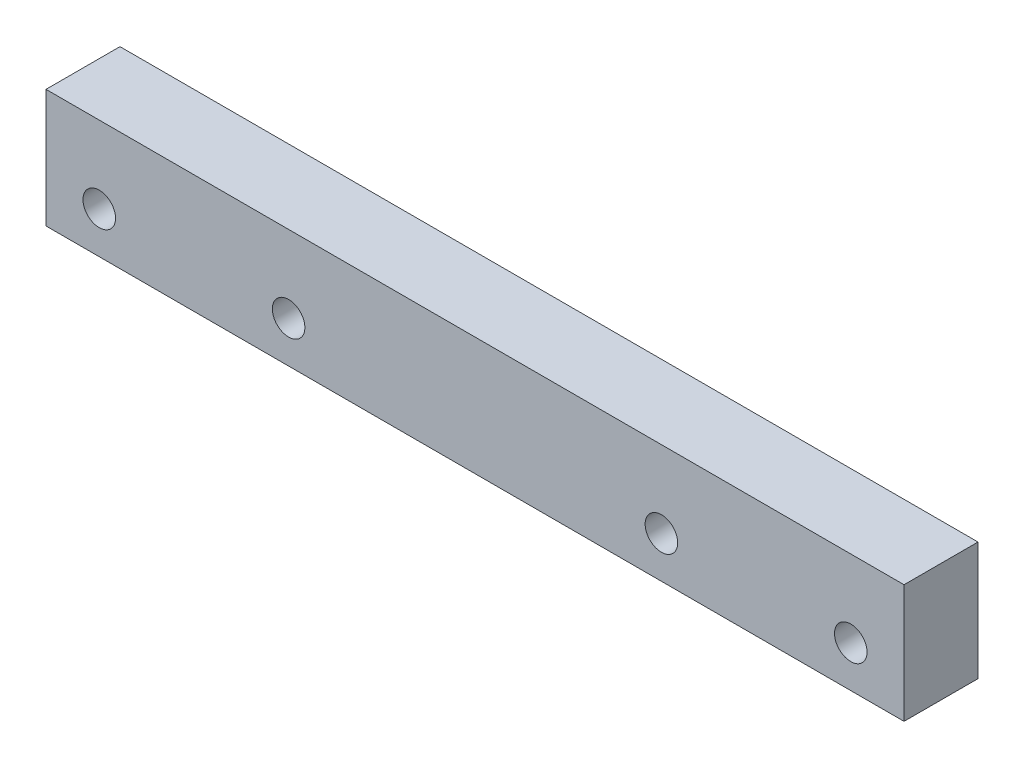
ISO-10303-21;
HEADER;
FILE_DESCRIPTION(('STEP AP214'),'2;1');
FILE_NAME('part.step','',(''),(''),'','','');
FILE_SCHEMA(('AUTOMOTIVE_DESIGN { 1 0 10303 214 1 1 1 1 }'));
ENDSEC;
DATA;
#1=APPLICATION_CONTEXT('core data for automotive mechanical design processes');
#2=APPLICATION_PROTOCOL_DEFINITION('international standard','automotive_design',2000,#1);
#3=PRODUCT_CONTEXT('',#1,'mechanical');
#4=PRODUCT('Part','Part','',(#3));
#5=PRODUCT_RELATED_PRODUCT_CATEGORY('part','',(#4));
#6=PRODUCT_DEFINITION_FORMATION('','',#4);
#7=PRODUCT_DEFINITION_CONTEXT('part definition',#1,'design');
#8=PRODUCT_DEFINITION('design','',#6,#7);
#9=PRODUCT_DEFINITION_SHAPE('','',#8);
#10=(LENGTH_UNIT() NAMED_UNIT(*) SI_UNIT(.MILLI.,.METRE.));
#11=(NAMED_UNIT(*) PLANE_ANGLE_UNIT() SI_UNIT($,.RADIAN.));
#12=(NAMED_UNIT(*) SI_UNIT($,.STERADIAN.) SOLID_ANGLE_UNIT());
#13=UNCERTAINTY_MEASURE_WITH_UNIT(LENGTH_MEASURE(1.E-05),#10,'distance_accuracy_value','');
#14=(GEOMETRIC_REPRESENTATION_CONTEXT(3) GLOBAL_UNCERTAINTY_ASSIGNED_CONTEXT((#13)) GLOBAL_UNIT_ASSIGNED_CONTEXT((#10,
#11,#12)) REPRESENTATION_CONTEXT('',''));
#15=CARTESIAN_POINT('',(0.,0.,0.));
#16=DIRECTION('',(0.,0.,1.));
#17=DIRECTION('',(1.,0.,0.));
#18=AXIS2_PLACEMENT_3D('',#15,#16,#17);
#19=CARTESIAN_POINT('',(72.5,-10.,12.5));
#20=DIRECTION('',(-1.,0.,0.));
#21=DIRECTION('',(0.,0.,1.));
#22=AXIS2_PLACEMENT_3D('',#19,#20,#21);
#23=PLANE('',#22);
#24=DIRECTION('',(0.,1.,0.));
#25=VECTOR('',#24,1.);
#26=CARTESIAN_POINT('',(72.5,-10.,0.));
#27=LINE('',#26,#25);
#28=CARTESIAN_POINT('',(72.5,-10.,0.));
#29=VERTEX_POINT('',#28);
#30=CARTESIAN_POINT('',(72.5,10.,0.));
#31=VERTEX_POINT('',#30);
#32=EDGE_CURVE('E113',#29,#31,#27,.T.);
#33=ORIENTED_EDGE('',*,*,#32,.T.);
#34=DIRECTION('',(0.,0.,-1.));
#35=VECTOR('',#34,1.);
#36=CARTESIAN_POINT('',(72.5,10.,12.5));
#37=LINE('',#36,#35);
#38=CARTESIAN_POINT('',(72.5,10.,12.5));
#39=VERTEX_POINT('',#38);
#40=EDGE_CURVE('E11',#39,#31,#37,.T.);
#41=ORIENTED_EDGE('',*,*,#40,.F.);
#42=DIRECTION('',(0.,1.,0.));
#43=VECTOR('',#42,1.);
#44=CARTESIAN_POINT('',(72.5,-10.,12.5));
#45=LINE('',#44,#43);
#46=CARTESIAN_POINT('',(72.5,-10.,12.5));
#47=VERTEX_POINT('',#46);
#48=EDGE_CURVE('E97',#47,#39,#45,.T.);
#49=ORIENTED_EDGE('',*,*,#48,.F.);
#50=DIRECTION('',(0.,0.,-1.));
#51=VECTOR('',#50,1.);
#52=CARTESIAN_POINT('',(72.5,-10.,12.5));
#53=LINE('',#52,#51);
#54=EDGE_CURVE('E109',#47,#29,#53,.T.);
#55=ORIENTED_EDGE('',*,*,#54,.T.);
#56=EDGE_LOOP('',(#33,#41,#49,#55));
#57=FACE_BOUND('',#56,.T.);
#58=ADVANCED_FACE('F45',(#57),#23,.F.);
#59=CARTESIAN_POINT('',(-72.5,10.,12.5));
#60=DIRECTION('',(0.,-1.,0.));
#61=DIRECTION('',(0.,0.,-1.));
#62=AXIS2_PLACEMENT_3D('',#59,#60,#61);
#63=PLANE('',#62);
#64=DIRECTION('',(-1.,0.,0.));
#65=VECTOR('',#64,1.);
#66=CARTESIAN_POINT('',(-72.5,10.,0.));
#67=LINE('',#66,#65);
#68=CARTESIAN_POINT('',(-72.5,10.,0.));
#69=VERTEX_POINT('',#68);
#70=EDGE_CURVE('E102',#31,#69,#67,.T.);
#71=ORIENTED_EDGE('',*,*,#70,.T.);
#72=DIRECTION('',(0.,0.,-1.));
#73=VECTOR('',#72,1.);
#74=CARTESIAN_POINT('',(-72.5,10.,12.5));
#75=LINE('',#74,#73);
#76=CARTESIAN_POINT('',(-72.5,10.,12.5));
#77=VERTEX_POINT('',#76);
#78=EDGE_CURVE('E54',#77,#69,#75,.T.);
#79=ORIENTED_EDGE('',*,*,#78,.F.);
#80=DIRECTION('',(-1.,0.,0.));
#81=VECTOR('',#80,1.);
#82=CARTESIAN_POINT('',(-72.5,10.,12.5));
#83=LINE('',#82,#81);
#84=EDGE_CURVE('E92',#39,#77,#83,.T.);
#85=ORIENTED_EDGE('',*,*,#84,.F.);
#86=ORIENTED_EDGE('',*,*,#40,.T.);
#87=EDGE_LOOP('',(#71,#79,#85,#86));
#88=FACE_BOUND('',#87,.T.);
#89=ADVANCED_FACE('F101',(#88),#63,.F.);
#90=CARTESIAN_POINT('',(-72.5,-10.,12.5));
#91=DIRECTION('',(1.,0.,0.));
#92=DIRECTION('',(0.,0.,-1.));
#93=AXIS2_PLACEMENT_3D('',#90,#91,#92);
#94=PLANE('',#93);
#95=DIRECTION('',(0.,-1.,0.));
#96=VECTOR('',#95,1.);
#97=CARTESIAN_POINT('',(-72.5,-10.,0.));
#98=LINE('',#97,#96);
#99=CARTESIAN_POINT('',(-72.5,-10.,0.));
#100=VERTEX_POINT('',#99);
#101=EDGE_CURVE('E79',#69,#100,#98,.T.);
#102=ORIENTED_EDGE('',*,*,#101,.T.);
#103=DIRECTION('',(0.,0.,-1.));
#104=VECTOR('',#103,1.);
#105=CARTESIAN_POINT('',(-72.5,-10.,12.5));
#106=LINE('',#105,#104);
#107=CARTESIAN_POINT('',(-72.5,-10.,12.5));
#108=VERTEX_POINT('',#107);
#109=EDGE_CURVE('E104',#108,#100,#106,.T.);
#110=ORIENTED_EDGE('',*,*,#109,.F.);
#111=DIRECTION('',(0.,-1.,0.));
#112=VECTOR('',#111,1.);
#113=CARTESIAN_POINT('',(-72.5,-10.,12.5));
#114=LINE('',#113,#112);
#115=EDGE_CURVE('E95',#77,#108,#114,.T.);
#116=ORIENTED_EDGE('',*,*,#115,.F.);
#117=ORIENTED_EDGE('',*,*,#78,.T.);
#118=EDGE_LOOP('',(#102,#110,#116,#117));
#119=FACE_BOUND('',#118,.T.);
#120=ADVANCED_FACE('F105',(#119),#94,.F.);
#121=CARTESIAN_POINT('',(-72.5,-10.,12.5));
#122=DIRECTION('',(0.,1.,0.));
#123=DIRECTION('',(0.,0.,1.));
#124=AXIS2_PLACEMENT_3D('',#121,#122,#123);
#125=PLANE('',#124);
#126=DIRECTION('',(1.,0.,0.));
#127=VECTOR('',#126,1.);
#128=CARTESIAN_POINT('',(-72.5,-10.,0.));
#129=LINE('',#128,#127);
#130=EDGE_CURVE('E85',#100,#29,#129,.T.);
#131=ORIENTED_EDGE('',*,*,#130,.T.);
#132=ORIENTED_EDGE('',*,*,#54,.F.);
#133=DIRECTION('',(1.,0.,0.));
#134=VECTOR('',#133,1.);
#135=CARTESIAN_POINT('',(-72.5,-10.,12.5));
#136=LINE('',#135,#134);
#137=EDGE_CURVE('E62',#108,#47,#136,.T.);
#138=ORIENTED_EDGE('',*,*,#137,.F.);
#139=ORIENTED_EDGE('',*,*,#109,.T.);
#140=EDGE_LOOP('',(#131,#132,#138,#139));
#141=FACE_BOUND('',#140,.T.);
#142=ADVANCED_FACE('F127',(#141),#125,.F.);
#143=CARTESIAN_POINT('',(0.,0.,12.5));
#144=DIRECTION('',(0.,0.,-1.));
#145=DIRECTION('',(-1.,0.,0.));
#146=AXIS2_PLACEMENT_3D('',#143,#144,#145);
#147=PLANE('',#146);
#148=CARTESIAN_POINT('',(63.5,-3.,12.5));
#149=DIRECTION('',(0.,0.,-1.));
#150=DIRECTION('',(-1.,0.,0.));
#151=AXIS2_PLACEMENT_3D('',#148,#149,#150);
#152=CIRCLE('',#151,2.75);
#153=CARTESIAN_POINT('',(60.75,-3.,12.5));
#154=VERTEX_POINT('',#153);
#155=EDGE_CURVE('E117',#154,#154,#152,.F.);
#156=ORIENTED_EDGE('',*,*,#155,.F.);
#157=EDGE_LOOP('',(#156));
#158=FACE_BOUND('',#157,.T.);
#159=CARTESIAN_POINT('',(31.5,-3.,12.5));
#160=DIRECTION('',(0.,0.,-1.));
#161=DIRECTION('',(-1.,0.,0.));
#162=AXIS2_PLACEMENT_3D('',#159,#160,#161);
#163=CIRCLE('',#162,2.75);
#164=CARTESIAN_POINT('',(28.75,-3.,12.5));
#165=VERTEX_POINT('',#164);
#166=EDGE_CURVE('E147',#165,#165,#163,.F.);
#167=ORIENTED_EDGE('',*,*,#166,.F.);
#168=EDGE_LOOP('',(#167));
#169=FACE_BOUND('',#168,.T.);
#170=CARTESIAN_POINT('',(-31.5,-3.,12.5));
#171=DIRECTION('',(0.,0.,-1.));
#172=DIRECTION('',(-1.,0.,0.));
#173=AXIS2_PLACEMENT_3D('',#170,#171,#172);
#174=CIRCLE('',#173,2.75);
#175=CARTESIAN_POINT('',(-34.25,-3.,12.5));
#176=VERTEX_POINT('',#175);
#177=EDGE_CURVE('E138',#176,#176,#174,.F.);
#178=ORIENTED_EDGE('',*,*,#177,.F.);
#179=EDGE_LOOP('',(#178));
#180=FACE_BOUND('',#179,.T.);
#181=CARTESIAN_POINT('',(-63.5,-3.,12.5));
#182=DIRECTION('',(0.,0.,-1.));
#183=DIRECTION('',(-1.,0.,0.));
#184=AXIS2_PLACEMENT_3D('',#181,#182,#183);
#185=CIRCLE('',#184,2.75);
#186=CARTESIAN_POINT('',(-66.25,-3.,12.5));
#187=VERTEX_POINT('',#186);
#188=EDGE_CURVE('E139',#187,#187,#185,.F.);
#189=ORIENTED_EDGE('',*,*,#188,.F.);
#190=EDGE_LOOP('',(#189));
#191=FACE_BOUND('',#190,.T.);
#192=ORIENTED_EDGE('',*,*,#48,.T.);
#193=ORIENTED_EDGE('',*,*,#84,.T.);
#194=ORIENTED_EDGE('',*,*,#115,.T.);
#195=ORIENTED_EDGE('',*,*,#137,.T.);
#196=EDGE_LOOP('',(#192,#193,#194,#195));
#197=FACE_BOUND('',#196,.T.);
#198=ADVANCED_FACE('F93',(#158,#169,#180,#191,#197),#147,.F.);
#199=CARTESIAN_POINT('',(0.,0.,0.));
#200=DIRECTION('',(0.,0.,-1.));
#201=DIRECTION('',(-1.,0.,0.));
#202=AXIS2_PLACEMENT_3D('',#199,#200,#201);
#203=PLANE('',#202);
#204=CARTESIAN_POINT('',(63.5,-3.,0.));
#205=DIRECTION('',(0.,0.,-1.));
#206=DIRECTION('',(-1.,0.,0.));
#207=AXIS2_PLACEMENT_3D('',#204,#205,#206);
#208=CIRCLE('',#207,2.75);
#209=CARTESIAN_POINT('',(60.75,-3.,0.));
#210=VERTEX_POINT('',#209);
#211=EDGE_CURVE('E155',#210,#210,#208,.T.);
#212=ORIENTED_EDGE('',*,*,#211,.F.);
#213=EDGE_LOOP('',(#212));
#214=FACE_BOUND('',#213,.T.);
#215=CARTESIAN_POINT('',(31.5,-3.,0.));
#216=DIRECTION('',(0.,0.,-1.));
#217=DIRECTION('',(-1.,0.,0.));
#218=AXIS2_PLACEMENT_3D('',#215,#216,#217);
#219=CIRCLE('',#218,2.75);
#220=CARTESIAN_POINT('',(28.75,-3.,0.));
#221=VERTEX_POINT('',#220);
#222=EDGE_CURVE('E151',#221,#221,#219,.T.);
#223=ORIENTED_EDGE('',*,*,#222,.F.);
#224=EDGE_LOOP('',(#223));
#225=FACE_BOUND('',#224,.T.);
#226=CARTESIAN_POINT('',(-31.5,-3.,0.));
#227=DIRECTION('',(0.,0.,-1.));
#228=DIRECTION('',(1.,0.,0.));
#229=AXIS2_PLACEMENT_3D('',#226,#227,#228);
#230=CIRCLE('',#229,2.75);
#231=CARTESIAN_POINT('',(-28.75,-3.,0.));
#232=VERTEX_POINT('',#231);
#233=EDGE_CURVE('E143',#232,#232,#230,.T.);
#234=ORIENTED_EDGE('',*,*,#233,.F.);
#235=EDGE_LOOP('',(#234));
#236=FACE_BOUND('',#235,.T.);
#237=CARTESIAN_POINT('',(-63.5,-3.,0.));
#238=DIRECTION('',(0.,0.,-1.));
#239=DIRECTION('',(1.,0.,0.));
#240=AXIS2_PLACEMENT_3D('',#237,#238,#239);
#241=CIRCLE('',#240,2.75);
#242=CARTESIAN_POINT('',(-60.75,-3.,0.));
#243=VERTEX_POINT('',#242);
#244=EDGE_CURVE('E134',#243,#243,#241,.T.);
#245=ORIENTED_EDGE('',*,*,#244,.F.);
#246=EDGE_LOOP('',(#245));
#247=FACE_BOUND('',#246,.T.);
#248=ORIENTED_EDGE('',*,*,#32,.F.);
#249=ORIENTED_EDGE('',*,*,#130,.F.);
#250=ORIENTED_EDGE('',*,*,#101,.F.);
#251=ORIENTED_EDGE('',*,*,#70,.F.);
#252=EDGE_LOOP('',(#248,#249,#250,#251));
#253=FACE_BOUND('',#252,.T.);
#254=ADVANCED_FACE('F130',(#214,#225,#236,#247,#253),#203,.T.);
#255=CARTESIAN_POINT('',(-63.5,-3.,20.278174593052));
#256=DIRECTION('',(0.,0.,-1.));
#257=DIRECTION('',(-1.,0.,0.));
#258=AXIS2_PLACEMENT_3D('',#255,#256,#257);
#259=CYLINDRICAL_SURFACE('',#258,2.75);
#260=ORIENTED_EDGE('',*,*,#188,.T.);
#261=EDGE_LOOP('',(#260));
#262=FACE_BOUND('',#261,.T.);
#263=ORIENTED_EDGE('',*,*,#244,.T.);
#264=EDGE_LOOP('',(#263));
#265=FACE_BOUND('',#264,.T.);
#266=ADVANCED_FACE('F170',(#262,#265),#259,.F.);
#267=CARTESIAN_POINT('',(-31.5,-3.,20.278174593052));
#268=DIRECTION('',(0.,0.,-1.));
#269=DIRECTION('',(-1.,0.,0.));
#270=AXIS2_PLACEMENT_3D('',#267,#268,#269);
#271=CYLINDRICAL_SURFACE('',#270,2.75);
#272=ORIENTED_EDGE('',*,*,#177,.T.);
#273=EDGE_LOOP('',(#272));
#274=FACE_BOUND('',#273,.T.);
#275=ORIENTED_EDGE('',*,*,#233,.T.);
#276=EDGE_LOOP('',(#275));
#277=FACE_BOUND('',#276,.T.);
#278=ADVANCED_FACE('F179',(#274,#277),#271,.F.);
#279=CARTESIAN_POINT('',(31.5,-3.,20.278174593052));
#280=DIRECTION('',(0.,0.,-1.));
#281=DIRECTION('',(-1.,0.,0.));
#282=AXIS2_PLACEMENT_3D('',#279,#280,#281);
#283=CYLINDRICAL_SURFACE('',#282,2.75);
#284=ORIENTED_EDGE('',*,*,#166,.T.);
#285=EDGE_LOOP('',(#284));
#286=FACE_BOUND('',#285,.T.);
#287=ORIENTED_EDGE('',*,*,#222,.T.);
#288=EDGE_LOOP('',(#287));
#289=FACE_BOUND('',#288,.T.);
#290=ADVANCED_FACE('F185',(#286,#289),#283,.F.);
#291=CARTESIAN_POINT('',(63.5,-3.,20.278174593052));
#292=DIRECTION('',(0.,0.,-1.));
#293=DIRECTION('',(-1.,0.,0.));
#294=AXIS2_PLACEMENT_3D('',#291,#292,#293);
#295=CYLINDRICAL_SURFACE('',#294,2.75);
#296=ORIENTED_EDGE('',*,*,#155,.T.);
#297=EDGE_LOOP('',(#296));
#298=FACE_BOUND('',#297,.T.);
#299=ORIENTED_EDGE('',*,*,#211,.T.);
#300=EDGE_LOOP('',(#299));
#301=FACE_BOUND('',#300,.T.);
#302=ADVANCED_FACE('F166',(#298,#301),#295,.F.);
#303=CLOSED_SHELL('',(#58,#89,#120,#142,#198,#254,#266,#278,#290,#302));
#304=MANIFOLD_SOLID_BREP('B2',#303);
#305=ADVANCED_BREP_SHAPE_REPRESENTATION('',(#18,#304),#14);
#306=SHAPE_DEFINITION_REPRESENTATION(#9,#305);
ENDSEC;
END-ISO-10303-21;
